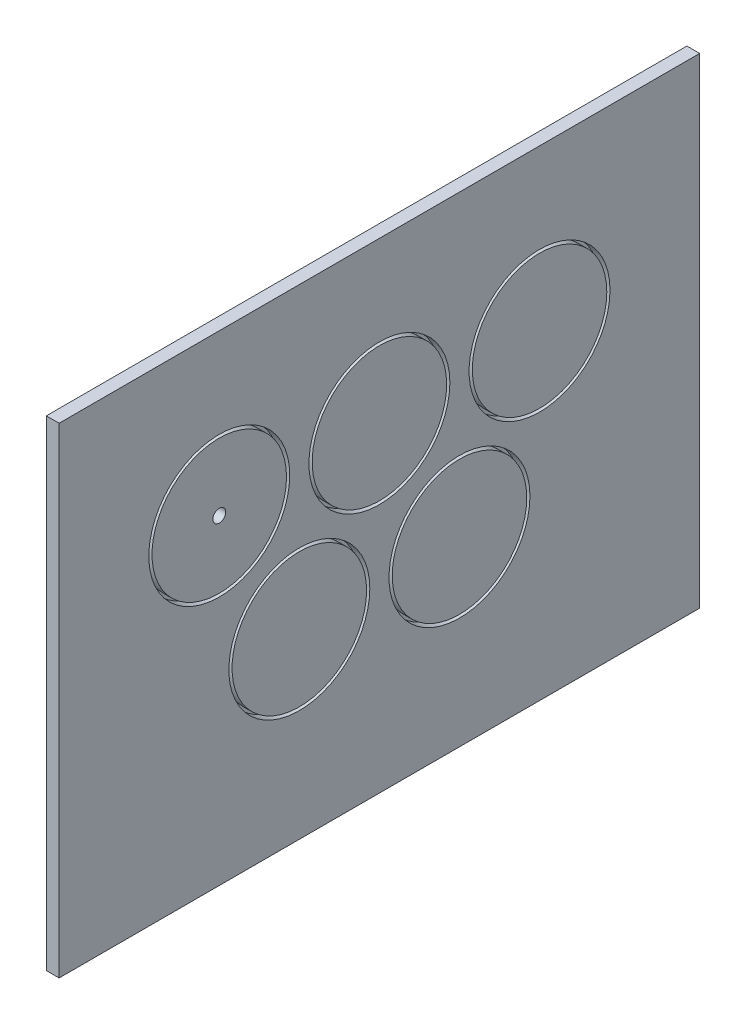
ISO-10303-21;
HEADER;
FILE_DESCRIPTION(('STEP AP214'),'2;1');
FILE_NAME('part.step','',(''),(''),'','','');
FILE_SCHEMA(('AUTOMOTIVE_DESIGN { 1 0 10303 214 1 1 1 1 }'));
ENDSEC;
DATA;
#1=APPLICATION_CONTEXT('core data for automotive mechanical design processes');
#2=APPLICATION_PROTOCOL_DEFINITION('international standard','automotive_design',2000,#1);
#3=PRODUCT_CONTEXT('',#1,'mechanical');
#4=PRODUCT('Part','Part','',(#3));
#5=PRODUCT_RELATED_PRODUCT_CATEGORY('part','',(#4));
#6=PRODUCT_DEFINITION_FORMATION('','',#4);
#7=PRODUCT_DEFINITION_CONTEXT('part definition',#1,'design');
#8=PRODUCT_DEFINITION('design','',#6,#7);
#9=PRODUCT_DEFINITION_SHAPE('','',#8);
#10=(LENGTH_UNIT() NAMED_UNIT(*) SI_UNIT(.MILLI.,.METRE.));
#11=(NAMED_UNIT(*) PLANE_ANGLE_UNIT() SI_UNIT($,.RADIAN.));
#12=(NAMED_UNIT(*) SI_UNIT($,.STERADIAN.) SOLID_ANGLE_UNIT());
#13=UNCERTAINTY_MEASURE_WITH_UNIT(LENGTH_MEASURE(1.E-05),#10,'distance_accuracy_value','');
#14=(GEOMETRIC_REPRESENTATION_CONTEXT(3) GLOBAL_UNCERTAINTY_ASSIGNED_CONTEXT((#13)) GLOBAL_UNIT_ASSIGNED_CONTEXT((#10,
#11,#12)) REPRESENTATION_CONTEXT('',''));
#15=CARTESIAN_POINT('',(0.,0.,0.));
#16=DIRECTION('',(0.,0.,1.));
#17=DIRECTION('',(1.,0.,0.));
#18=AXIS2_PLACEMENT_3D('',#15,#16,#17);
#19=CARTESIAN_POINT('',(20.,0.,0.));
#20=DIRECTION('',(-1.,0.,0.));
#21=DIRECTION('',(0.,0.,1.));
#22=AXIS2_PLACEMENT_3D('',#19,#20,#21);
#23=PLANE('',#22);
#24=CARTESIAN_POINT('',(20.,125.,250.));
#25=DIRECTION('',(1.,0.,0.));
#26=DIRECTION('',(0.,0.,-1.));
#27=AXIS2_PLACEMENT_3D('',#24,#25,#26);
#28=CIRCLE('',#27,9.99999999999998);
#29=CARTESIAN_POINT('',(20.,125.,240.));
#30=VERTEX_POINT('',#29);
#31=EDGE_CURVE('E129',#30,#30,#28,.T.);
#32=ORIENTED_EDGE('',*,*,#31,.F.);
#33=EDGE_LOOP('',(#32));
#34=FACE_BOUND('',#33,.T.);
#35=CARTESIAN_POINT('',(20.,125.,250.));
#36=DIRECTION('',(1.,0.,0.));
#37=DIRECTION('',(0.,0.,-1.));
#38=AXIS2_PLACEMENT_3D('',#35,#36,#37);
#39=CIRCLE('',#38,105.);
#40=CARTESIAN_POINT('',(20.,125.,145.));
#41=VERTEX_POINT('',#40);
#42=EDGE_CURVE('E152',#41,#41,#39,.T.);
#43=ORIENTED_EDGE('',*,*,#42,.T.);
#44=EDGE_LOOP('',(#43));
#45=FACE_BOUND('',#44,.T.);
#46=ADVANCED_FACE('F62',(#34,#45),#23,.F.);
#47=CARTESIAN_POINT('',(20.,-375.,-500.));
#48=DIRECTION('',(0.,0.,1.));
#49=DIRECTION('',(1.,0.,0.));
#50=AXIS2_PLACEMENT_3D('',#47,#48,#49);
#51=PLANE('',#50);
#52=DIRECTION('',(0.,1.,0.));
#53=VECTOR('',#52,1.);
#54=CARTESIAN_POINT('',(0.,-375.,-500.));
#55=LINE('',#54,#53);
#56=CARTESIAN_POINT('',(0.,-375.,-500.));
#57=VERTEX_POINT('',#56);
#58=CARTESIAN_POINT('',(0.,375.,-500.));
#59=VERTEX_POINT('',#58);
#60=EDGE_CURVE('E126',#57,#59,#55,.T.);
#61=ORIENTED_EDGE('',*,*,#60,.T.);
#62=DIRECTION('',(-1.,0.,0.));
#63=VECTOR('',#62,1.);
#64=CARTESIAN_POINT('',(20.,375.,-500.));
#65=LINE('',#64,#63);
#66=CARTESIAN_POINT('',(20.,375.,-500.));
#67=VERTEX_POINT('',#66);
#68=EDGE_CURVE('E12',#67,#59,#65,.T.);
#69=ORIENTED_EDGE('',*,*,#68,.F.);
#70=DIRECTION('',(0.,1.,0.));
#71=VECTOR('',#70,1.);
#72=CARTESIAN_POINT('',(20.,-375.,-500.));
#73=LINE('',#72,#71);
#74=CARTESIAN_POINT('',(20.,-375.,-500.));
#75=VERTEX_POINT('',#74);
#76=EDGE_CURVE('E114',#75,#67,#73,.T.);
#77=ORIENTED_EDGE('',*,*,#76,.F.);
#78=DIRECTION('',(-1.,0.,0.));
#79=VECTOR('',#78,1.);
#80=CARTESIAN_POINT('',(20.,-375.,-500.));
#81=LINE('',#80,#79);
#82=EDGE_CURVE('E122',#75,#57,#81,.T.);
#83=ORIENTED_EDGE('',*,*,#82,.T.);
#84=EDGE_LOOP('',(#61,#69,#77,#83));
#85=FACE_BOUND('',#84,.T.);
#86=ADVANCED_FACE('F64',(#85),#51,.F.);
#87=CARTESIAN_POINT('',(20.,375.,500.));
#88=DIRECTION('',(0.,-1.,0.));
#89=DIRECTION('',(0.,0.,-1.));
#90=AXIS2_PLACEMENT_3D('',#87,#88,#89);
#91=PLANE('',#90);
#92=DIRECTION('',(0.,0.,1.));
#93=VECTOR('',#92,1.);
#94=CARTESIAN_POINT('',(0.,375.,500.));
#95=LINE('',#94,#93);
#96=CARTESIAN_POINT('',(0.,375.,500.));
#97=VERTEX_POINT('',#96);
#98=EDGE_CURVE('E118',#59,#97,#95,.T.);
#99=ORIENTED_EDGE('',*,*,#98,.T.);
#100=DIRECTION('',(-1.,0.,0.));
#101=VECTOR('',#100,1.);
#102=CARTESIAN_POINT('',(20.,375.,500.));
#103=LINE('',#102,#101);
#104=CARTESIAN_POINT('',(20.,375.,500.));
#105=VERTEX_POINT('',#104);
#106=EDGE_CURVE('E71',#105,#97,#103,.T.);
#107=ORIENTED_EDGE('',*,*,#106,.F.);
#108=DIRECTION('',(0.,0.,1.));
#109=VECTOR('',#108,1.);
#110=CARTESIAN_POINT('',(20.,375.,500.));
#111=LINE('',#110,#109);
#112=EDGE_CURVE('E109',#67,#105,#111,.T.);
#113=ORIENTED_EDGE('',*,*,#112,.F.);
#114=ORIENTED_EDGE('',*,*,#68,.T.);
#115=EDGE_LOOP('',(#99,#107,#113,#114));
#116=FACE_BOUND('',#115,.T.);
#117=ADVANCED_FACE('F117',(#116),#91,.F.);
#118=CARTESIAN_POINT('',(20.,-375.,500.));
#119=DIRECTION('',(0.,0.,-1.));
#120=DIRECTION('',(-1.,0.,0.));
#121=AXIS2_PLACEMENT_3D('',#118,#119,#120);
#122=PLANE('',#121);
#123=DIRECTION('',(0.,-1.,0.));
#124=VECTOR('',#123,1.);
#125=CARTESIAN_POINT('',(0.,-375.,500.));
#126=LINE('',#125,#124);
#127=CARTESIAN_POINT('',(0.,-375.,500.));
#128=VERTEX_POINT('',#127);
#129=EDGE_CURVE('E96',#97,#128,#126,.T.);
#130=ORIENTED_EDGE('',*,*,#129,.T.);
#131=DIRECTION('',(-1.,0.,0.));
#132=VECTOR('',#131,1.);
#133=CARTESIAN_POINT('',(20.,-375.,500.));
#134=LINE('',#133,#132);
#135=CARTESIAN_POINT('',(20.,-375.,500.));
#136=VERTEX_POINT('',#135);
#137=EDGE_CURVE('E119',#136,#128,#134,.T.);
#138=ORIENTED_EDGE('',*,*,#137,.F.);
#139=DIRECTION('',(0.,-1.,0.));
#140=VECTOR('',#139,1.);
#141=CARTESIAN_POINT('',(20.,-375.,500.));
#142=LINE('',#141,#140);
#143=EDGE_CURVE('E112',#105,#136,#142,.T.);
#144=ORIENTED_EDGE('',*,*,#143,.F.);
#145=ORIENTED_EDGE('',*,*,#106,.T.);
#146=EDGE_LOOP('',(#130,#138,#144,#145));
#147=FACE_BOUND('',#146,.T.);
#148=ADVANCED_FACE('F120',(#147),#122,.F.);
#149=CARTESIAN_POINT('',(20.,-375.,500.));
#150=DIRECTION('',(0.,1.,0.));
#151=DIRECTION('',(0.,0.,1.));
#152=AXIS2_PLACEMENT_3D('',#149,#150,#151);
#153=PLANE('',#152);
#154=DIRECTION('',(0.,0.,-1.));
#155=VECTOR('',#154,1.);
#156=CARTESIAN_POINT('',(0.,-375.,500.));
#157=LINE('',#156,#155);
#158=EDGE_CURVE('E102',#128,#57,#157,.T.);
#159=ORIENTED_EDGE('',*,*,#158,.T.);
#160=ORIENTED_EDGE('',*,*,#82,.F.);
#161=DIRECTION('',(0.,0.,-1.));
#162=VECTOR('',#161,1.);
#163=CARTESIAN_POINT('',(20.,-375.,500.));
#164=LINE('',#163,#162);
#165=EDGE_CURVE('E79',#136,#75,#164,.T.);
#166=ORIENTED_EDGE('',*,*,#165,.F.);
#167=ORIENTED_EDGE('',*,*,#137,.T.);
#168=EDGE_LOOP('',(#159,#160,#166,#167));
#169=FACE_BOUND('',#168,.T.);
#170=ADVANCED_FACE('F134',(#169),#153,.F.);
#171=CARTESIAN_POINT('',(20.,-91.0000000000001,-125.));
#172=DIRECTION('',(1.,0.,0.));
#173=DIRECTION('',(0.,0.,-1.));
#174=AXIS2_PLACEMENT_3D('',#171,#172,#173);
#175=CIRCLE('',#174,110.);
#176=CARTESIAN_POINT('',(20.,-91.0000000000001,-235.));
#177=VERTEX_POINT('',#176);
#178=EDGE_CURVE('E182',#177,#177,#175,.T.);
#179=ORIENTED_EDGE('',*,*,#178,.F.);
#180=EDGE_LOOP('',(#179));
#181=FACE_BOUND('',#180,.T.);
#182=CARTESIAN_POINT('',(20.,125.,-1.11022302462516E-13));
#183=DIRECTION('',(1.,0.,0.));
#184=DIRECTION('',(0.,0.,-1.));
#185=AXIS2_PLACEMENT_3D('',#182,#183,#184);
#186=CIRCLE('',#185,110.);
#187=CARTESIAN_POINT('',(20.,125.,-110.));
#188=VERTEX_POINT('',#187);
#189=EDGE_CURVE('E170',#188,#188,#186,.T.);
#190=ORIENTED_EDGE('',*,*,#189,.F.);
#191=EDGE_LOOP('',(#190));
#192=FACE_BOUND('',#191,.T.);
#193=CARTESIAN_POINT('',(20.,125.,-250.));
#194=DIRECTION('',(1.,0.,0.));
#195=DIRECTION('',(0.,0.,-1.));
#196=AXIS2_PLACEMENT_3D('',#193,#194,#195);
#197=CIRCLE('',#196,110.);
#198=CARTESIAN_POINT('',(20.,125.,-360.));
#199=VERTEX_POINT('',#198);
#200=EDGE_CURVE('E194',#199,#199,#197,.T.);
#201=ORIENTED_EDGE('',*,*,#200,.F.);
#202=EDGE_LOOP('',(#201));
#203=FACE_BOUND('',#202,.T.);
#204=CARTESIAN_POINT('',(20.,-91.0000000000001,125.));
#205=DIRECTION('',(1.,0.,0.));
#206=DIRECTION('',(0.,0.,-1.));
#207=AXIS2_PLACEMENT_3D('',#204,#205,#206);
#208=CIRCLE('',#207,110.);
#209=CARTESIAN_POINT('',(20.,-91.0000000000001,14.9999999999999));
#210=VERTEX_POINT('',#209);
#211=EDGE_CURVE('E158',#210,#210,#208,.T.);
#212=ORIENTED_EDGE('',*,*,#211,.F.);
#213=EDGE_LOOP('',(#212));
#214=FACE_BOUND('',#213,.T.);
#215=CARTESIAN_POINT('',(20.,125.,250.));
#216=DIRECTION('',(1.,0.,0.));
#217=DIRECTION('',(0.,0.,-1.));
#218=AXIS2_PLACEMENT_3D('',#215,#216,#217);
#219=CIRCLE('',#218,110.);
#220=CARTESIAN_POINT('',(20.,125.,140.));
#221=VERTEX_POINT('',#220);
#222=EDGE_CURVE('E146',#221,#221,#219,.T.);
#223=ORIENTED_EDGE('',*,*,#222,.F.);
#224=EDGE_LOOP('',(#223));
#225=FACE_BOUND('',#224,.T.);
#226=ORIENTED_EDGE('',*,*,#76,.T.);
#227=ORIENTED_EDGE('',*,*,#112,.T.);
#228=ORIENTED_EDGE('',*,*,#143,.T.);
#229=ORIENTED_EDGE('',*,*,#165,.T.);
#230=EDGE_LOOP('',(#226,#227,#228,#229));
#231=FACE_BOUND('',#230,.T.);
#232=ADVANCED_FACE('F110',(#181,#192,#203,#214,#225,#231),#23,.F.);
#233=CARTESIAN_POINT('',(0.,0.,0.));
#234=DIRECTION('',(-1.,0.,0.));
#235=DIRECTION('',(0.,0.,1.));
#236=AXIS2_PLACEMENT_3D('',#233,#234,#235);
#237=PLANE('',#236);
#238=CARTESIAN_POINT('',(0.,125.,250.));
#239=DIRECTION('',(-1.,0.,0.));
#240=DIRECTION('',(0.,0.,1.));
#241=AXIS2_PLACEMENT_3D('',#238,#239,#240);
#242=CIRCLE('',#241,9.99999999999998);
#243=CARTESIAN_POINT('',(0.,125.,260.));
#244=VERTEX_POINT('',#243);
#245=EDGE_CURVE('E140',#244,#244,#242,.F.);
#246=ORIENTED_EDGE('',*,*,#245,.T.);
#247=EDGE_LOOP('',(#246));
#248=FACE_BOUND('',#247,.T.);
#249=ORIENTED_EDGE('',*,*,#60,.F.);
#250=ORIENTED_EDGE('',*,*,#158,.F.);
#251=ORIENTED_EDGE('',*,*,#129,.F.);
#252=ORIENTED_EDGE('',*,*,#98,.F.);
#253=EDGE_LOOP('',(#249,#250,#251,#252));
#254=FACE_BOUND('',#253,.T.);
#255=ADVANCED_FACE('F137',(#248,#254),#237,.T.);
#256=CARTESIAN_POINT('',(-0.001000000000001,125.,250.));
#257=DIRECTION('',(1.,0.,0.));
#258=DIRECTION('',(0.,0.,-1.));
#259=AXIS2_PLACEMENT_3D('',#256,#257,#258);
#260=CYLINDRICAL_SURFACE('',#259,9.99999999999998);
#261=ORIENTED_EDGE('',*,*,#245,.F.);
#262=EDGE_LOOP('',(#261));
#263=FACE_BOUND('',#262,.T.);
#264=ORIENTED_EDGE('',*,*,#31,.T.);
#265=EDGE_LOOP('',(#264));
#266=FACE_BOUND('',#265,.T.);
#267=ADVANCED_FACE('F234',(#263,#266),#260,.F.);
#268=CARTESIAN_POINT('',(5.,125.,250.));
#269=DIRECTION('',(1.,0.,0.));
#270=DIRECTION('',(0.,0.,-1.));
#271=AXIS2_PLACEMENT_3D('',#268,#269,#270);
#272=CYLINDRICAL_SURFACE('',#271,110.);
#273=CARTESIAN_POINT('',(5.,125.,250.));
#274=DIRECTION('',(1.,0.,0.));
#275=DIRECTION('',(0.,0.,-1.));
#276=AXIS2_PLACEMENT_3D('',#273,#274,#275);
#277=CIRCLE('',#276,110.);
#278=CARTESIAN_POINT('',(5.,125.,140.));
#279=VERTEX_POINT('',#278);
#280=EDGE_CURVE('E143',#279,#279,#277,.T.);
#281=ORIENTED_EDGE('',*,*,#280,.F.);
#282=EDGE_LOOP('',(#281));
#283=FACE_BOUND('',#282,.T.);
#284=ORIENTED_EDGE('',*,*,#222,.T.);
#285=EDGE_LOOP('',(#284));
#286=FACE_BOUND('',#285,.T.);
#287=ADVANCED_FACE('F231',(#283,#286),#272,.F.);
#288=CARTESIAN_POINT('',(5.,125.,250.));
#289=DIRECTION('',(1.,0.,0.));
#290=DIRECTION('',(0.,0.,-1.));
#291=AXIS2_PLACEMENT_3D('',#288,#289,#290);
#292=PLANE('',#291);
#293=CARTESIAN_POINT('',(5.,125.,250.));
#294=DIRECTION('',(1.,0.,0.));
#295=DIRECTION('',(0.,0.,-1.));
#296=AXIS2_PLACEMENT_3D('',#293,#294,#295);
#297=CIRCLE('',#296,105.);
#298=CARTESIAN_POINT('',(5.,125.,145.));
#299=VERTEX_POINT('',#298);
#300=EDGE_CURVE('E149',#299,#299,#297,.T.);
#301=ORIENTED_EDGE('',*,*,#300,.F.);
#302=EDGE_LOOP('',(#301));
#303=FACE_BOUND('',#302,.T.);
#304=ORIENTED_EDGE('',*,*,#280,.T.);
#305=EDGE_LOOP('',(#304));
#306=FACE_BOUND('',#305,.T.);
#307=ADVANCED_FACE('F233',(#303,#306),#292,.T.);
#308=CARTESIAN_POINT('',(5.,125.,250.));
#309=DIRECTION('',(1.,0.,0.));
#310=DIRECTION('',(0.,0.,-1.));
#311=AXIS2_PLACEMENT_3D('',#308,#309,#310);
#312=CYLINDRICAL_SURFACE('',#311,105.);
#313=ORIENTED_EDGE('',*,*,#300,.T.);
#314=EDGE_LOOP('',(#313));
#315=FACE_BOUND('',#314,.T.);
#316=ORIENTED_EDGE('',*,*,#42,.F.);
#317=EDGE_LOOP('',(#316));
#318=FACE_BOUND('',#317,.T.);
#319=ADVANCED_FACE('F241',(#315,#318),#312,.T.);
#320=CARTESIAN_POINT('',(5.,-91.0000000000001,125.));
#321=DIRECTION('',(1.,0.,0.));
#322=DIRECTION('',(0.,0.,-1.));
#323=AXIS2_PLACEMENT_3D('',#320,#321,#322);
#324=CYLINDRICAL_SURFACE('',#323,110.);
#325=CARTESIAN_POINT('',(5.,-91.0000000000001,125.));
#326=DIRECTION('',(1.,0.,0.));
#327=DIRECTION('',(0.,0.,-1.));
#328=AXIS2_PLACEMENT_3D('',#325,#326,#327);
#329=CIRCLE('',#328,110.);
#330=CARTESIAN_POINT('',(5.,-91.0000000000001,14.9999999999999));
#331=VERTEX_POINT('',#330);
#332=EDGE_CURVE('E155',#331,#331,#329,.T.);
#333=ORIENTED_EDGE('',*,*,#332,.F.);
#334=EDGE_LOOP('',(#333));
#335=FACE_BOUND('',#334,.T.);
#336=ORIENTED_EDGE('',*,*,#211,.T.);
#337=EDGE_LOOP('',(#336));
#338=FACE_BOUND('',#337,.T.);
#339=ADVANCED_FACE('F278',(#335,#338),#324,.F.);
#340=CARTESIAN_POINT('',(5.,-91.0000000000001,125.));
#341=DIRECTION('',(1.,0.,0.));
#342=DIRECTION('',(0.,0.,-1.));
#343=AXIS2_PLACEMENT_3D('',#340,#341,#342);
#344=PLANE('',#343);
#345=CARTESIAN_POINT('',(5.,-91.0000000000001,125.));
#346=DIRECTION('',(1.,0.,0.));
#347=DIRECTION('',(0.,0.,-1.));
#348=AXIS2_PLACEMENT_3D('',#345,#346,#347);
#349=CIRCLE('',#348,105.);
#350=CARTESIAN_POINT('',(5.,-91.0000000000001,19.9999999999999));
#351=VERTEX_POINT('',#350);
#352=EDGE_CURVE('E161',#351,#351,#349,.T.);
#353=ORIENTED_EDGE('',*,*,#352,.F.);
#354=EDGE_LOOP('',(#353));
#355=FACE_BOUND('',#354,.T.);
#356=ORIENTED_EDGE('',*,*,#332,.T.);
#357=EDGE_LOOP('',(#356));
#358=FACE_BOUND('',#357,.T.);
#359=ADVANCED_FACE('F272',(#355,#358),#344,.T.);
#360=CARTESIAN_POINT('',(5.,-91.0000000000001,125.));
#361=DIRECTION('',(1.,0.,0.));
#362=DIRECTION('',(0.,0.,-1.));
#363=AXIS2_PLACEMENT_3D('',#360,#361,#362);
#364=CYLINDRICAL_SURFACE('',#363,105.);
#365=ORIENTED_EDGE('',*,*,#352,.T.);
#366=EDGE_LOOP('',(#365));
#367=FACE_BOUND('',#366,.T.);
#368=CARTESIAN_POINT('',(20.,-91.0000000000001,125.));
#369=DIRECTION('',(1.,0.,0.));
#370=DIRECTION('',(0.,0.,-1.));
#371=AXIS2_PLACEMENT_3D('',#368,#369,#370);
#372=CIRCLE('',#371,105.);
#373=CARTESIAN_POINT('',(20.,-91.0000000000001,19.9999999999999));
#374=VERTEX_POINT('',#373);
#375=EDGE_CURVE('E164',#374,#374,#372,.T.);
#376=ORIENTED_EDGE('',*,*,#375,.F.);
#377=EDGE_LOOP('',(#376));
#378=FACE_BOUND('',#377,.T.);
#379=ADVANCED_FACE('F218',(#367,#378),#364,.T.);
#380=CARTESIAN_POINT('',(5.,125.,-250.));
#381=DIRECTION('',(1.,0.,0.));
#382=DIRECTION('',(0.,0.,-1.));
#383=AXIS2_PLACEMENT_3D('',#380,#381,#382);
#384=CYLINDRICAL_SURFACE('',#383,110.);
#385=CARTESIAN_POINT('',(5.,125.,-250.));
#386=DIRECTION('',(1.,0.,0.));
#387=DIRECTION('',(0.,0.,-1.));
#388=AXIS2_PLACEMENT_3D('',#385,#386,#387);
#389=CIRCLE('',#388,110.);
#390=CARTESIAN_POINT('',(5.,125.,-360.));
#391=VERTEX_POINT('',#390);
#392=EDGE_CURVE('E191',#391,#391,#389,.T.);
#393=ORIENTED_EDGE('',*,*,#392,.F.);
#394=EDGE_LOOP('',(#393));
#395=FACE_BOUND('',#394,.T.);
#396=ORIENTED_EDGE('',*,*,#200,.T.);
#397=EDGE_LOOP('',(#396));
#398=FACE_BOUND('',#397,.T.);
#399=ADVANCED_FACE('F212',(#395,#398),#384,.F.);
#400=CARTESIAN_POINT('',(5.,125.,-250.));
#401=DIRECTION('',(1.,0.,0.));
#402=DIRECTION('',(0.,0.,-1.));
#403=AXIS2_PLACEMENT_3D('',#400,#401,#402);
#404=PLANE('',#403);
#405=CARTESIAN_POINT('',(5.,125.,-250.));
#406=DIRECTION('',(1.,0.,0.));
#407=DIRECTION('',(0.,0.,-1.));
#408=AXIS2_PLACEMENT_3D('',#405,#406,#407);
#409=CIRCLE('',#408,105.);
#410=CARTESIAN_POINT('',(5.,125.,-355.));
#411=VERTEX_POINT('',#410);
#412=EDGE_CURVE('E197',#411,#411,#409,.T.);
#413=ORIENTED_EDGE('',*,*,#412,.F.);
#414=EDGE_LOOP('',(#413));
#415=FACE_BOUND('',#414,.T.);
#416=ORIENTED_EDGE('',*,*,#392,.T.);
#417=EDGE_LOOP('',(#416));
#418=FACE_BOUND('',#417,.T.);
#419=ADVANCED_FACE('F209',(#415,#418),#404,.T.);
#420=CARTESIAN_POINT('',(5.,125.,-250.));
#421=DIRECTION('',(1.,0.,0.));
#422=DIRECTION('',(0.,0.,-1.));
#423=AXIS2_PLACEMENT_3D('',#420,#421,#422);
#424=CYLINDRICAL_SURFACE('',#423,105.);
#425=ORIENTED_EDGE('',*,*,#412,.T.);
#426=EDGE_LOOP('',(#425));
#427=FACE_BOUND('',#426,.T.);
#428=CARTESIAN_POINT('',(20.,125.,-250.));
#429=DIRECTION('',(1.,0.,0.));
#430=DIRECTION('',(0.,0.,-1.));
#431=AXIS2_PLACEMENT_3D('',#428,#429,#430);
#432=CIRCLE('',#431,105.);
#433=CARTESIAN_POINT('',(20.,125.,-355.));
#434=VERTEX_POINT('',#433);
#435=EDGE_CURVE('E200',#434,#434,#432,.T.);
#436=ORIENTED_EDGE('',*,*,#435,.F.);
#437=EDGE_LOOP('',(#436));
#438=FACE_BOUND('',#437,.T.);
#439=ADVANCED_FACE('F206',(#427,#438),#424,.T.);
#440=CARTESIAN_POINT('',(5.,125.,-1.11022302462516E-13));
#441=DIRECTION('',(1.,0.,0.));
#442=DIRECTION('',(0.,0.,-1.));
#443=AXIS2_PLACEMENT_3D('',#440,#441,#442);
#444=CYLINDRICAL_SURFACE('',#443,110.);
#445=CARTESIAN_POINT('',(5.,125.,-1.11022302462516E-13));
#446=DIRECTION('',(1.,0.,0.));
#447=DIRECTION('',(0.,0.,-1.));
#448=AXIS2_PLACEMENT_3D('',#445,#446,#447);
#449=CIRCLE('',#448,110.);
#450=CARTESIAN_POINT('',(5.,125.,-110.));
#451=VERTEX_POINT('',#450);
#452=EDGE_CURVE('E167',#451,#451,#449,.T.);
#453=ORIENTED_EDGE('',*,*,#452,.F.);
#454=EDGE_LOOP('',(#453));
#455=FACE_BOUND('',#454,.T.);
#456=ORIENTED_EDGE('',*,*,#189,.T.);
#457=EDGE_LOOP('',(#456));
#458=FACE_BOUND('',#457,.T.);
#459=ADVANCED_FACE('F282',(#455,#458),#444,.F.);
#460=CARTESIAN_POINT('',(5.,125.,-1.11022302462516E-13));
#461=DIRECTION('',(1.,0.,0.));
#462=DIRECTION('',(0.,0.,-1.));
#463=AXIS2_PLACEMENT_3D('',#460,#461,#462);
#464=PLANE('',#463);
#465=CARTESIAN_POINT('',(5.,125.,-1.11022302462516E-13));
#466=DIRECTION('',(1.,0.,0.));
#467=DIRECTION('',(0.,0.,-1.));
#468=AXIS2_PLACEMENT_3D('',#465,#466,#467);
#469=CIRCLE('',#468,105.);
#470=CARTESIAN_POINT('',(5.,125.,-105.));
#471=VERTEX_POINT('',#470);
#472=EDGE_CURVE('E173',#471,#471,#469,.T.);
#473=ORIENTED_EDGE('',*,*,#472,.F.);
#474=EDGE_LOOP('',(#473));
#475=FACE_BOUND('',#474,.T.);
#476=ORIENTED_EDGE('',*,*,#452,.T.);
#477=EDGE_LOOP('',(#476));
#478=FACE_BOUND('',#477,.T.);
#479=ADVANCED_FACE('F340',(#475,#478),#464,.T.);
#480=CARTESIAN_POINT('',(5.,125.,-1.11022302462516E-13));
#481=DIRECTION('',(1.,0.,0.));
#482=DIRECTION('',(0.,0.,-1.));
#483=AXIS2_PLACEMENT_3D('',#480,#481,#482);
#484=CYLINDRICAL_SURFACE('',#483,105.);
#485=ORIENTED_EDGE('',*,*,#472,.T.);
#486=EDGE_LOOP('',(#485));
#487=FACE_BOUND('',#486,.T.);
#488=CARTESIAN_POINT('',(20.,125.,-1.11022302462516E-13));
#489=DIRECTION('',(1.,0.,0.));
#490=DIRECTION('',(0.,0.,-1.));
#491=AXIS2_PLACEMENT_3D('',#488,#489,#490);
#492=CIRCLE('',#491,105.);
#493=CARTESIAN_POINT('',(20.,125.,-105.));
#494=VERTEX_POINT('',#493);
#495=EDGE_CURVE('E176',#494,#494,#492,.T.);
#496=ORIENTED_EDGE('',*,*,#495,.F.);
#497=EDGE_LOOP('',(#496));
#498=FACE_BOUND('',#497,.T.);
#499=ADVANCED_FACE('F349',(#487,#498),#484,.T.);
#500=CARTESIAN_POINT('',(5.,-91.0000000000001,-125.));
#501=DIRECTION('',(1.,0.,0.));
#502=DIRECTION('',(0.,0.,-1.));
#503=AXIS2_PLACEMENT_3D('',#500,#501,#502);
#504=CYLINDRICAL_SURFACE('',#503,110.);
#505=CARTESIAN_POINT('',(5.,-91.0000000000001,-125.));
#506=DIRECTION('',(1.,0.,0.));
#507=DIRECTION('',(0.,0.,-1.));
#508=AXIS2_PLACEMENT_3D('',#505,#506,#507);
#509=CIRCLE('',#508,110.);
#510=CARTESIAN_POINT('',(5.,-91.0000000000001,-235.));
#511=VERTEX_POINT('',#510);
#512=EDGE_CURVE('E179',#511,#511,#509,.T.);
#513=ORIENTED_EDGE('',*,*,#512,.F.);
#514=EDGE_LOOP('',(#513));
#515=FACE_BOUND('',#514,.T.);
#516=ORIENTED_EDGE('',*,*,#178,.T.);
#517=EDGE_LOOP('',(#516));
#518=FACE_BOUND('',#517,.T.);
#519=ADVANCED_FACE('F358',(#515,#518),#504,.F.);
#520=CARTESIAN_POINT('',(5.,-91.0000000000001,-125.));
#521=DIRECTION('',(1.,0.,0.));
#522=DIRECTION('',(0.,0.,-1.));
#523=AXIS2_PLACEMENT_3D('',#520,#521,#522);
#524=PLANE('',#523);
#525=CARTESIAN_POINT('',(5.,-91.0000000000001,-125.));
#526=DIRECTION('',(1.,0.,0.));
#527=DIRECTION('',(0.,0.,-1.));
#528=AXIS2_PLACEMENT_3D('',#525,#526,#527);
#529=CIRCLE('',#528,105.);
#530=CARTESIAN_POINT('',(5.,-91.0000000000001,-230.));
#531=VERTEX_POINT('',#530);
#532=EDGE_CURVE('E185',#531,#531,#529,.T.);
#533=ORIENTED_EDGE('',*,*,#532,.F.);
#534=EDGE_LOOP('',(#533));
#535=FACE_BOUND('',#534,.T.);
#536=ORIENTED_EDGE('',*,*,#512,.T.);
#537=EDGE_LOOP('',(#536));
#538=FACE_BOUND('',#537,.T.);
#539=ADVANCED_FACE('F266',(#535,#538),#524,.T.);
#540=CARTESIAN_POINT('',(5.,-91.0000000000001,-125.));
#541=DIRECTION('',(1.,0.,0.));
#542=DIRECTION('',(0.,0.,-1.));
#543=AXIS2_PLACEMENT_3D('',#540,#541,#542);
#544=CYLINDRICAL_SURFACE('',#543,105.);
#545=ORIENTED_EDGE('',*,*,#532,.T.);
#546=EDGE_LOOP('',(#545));
#547=FACE_BOUND('',#546,.T.);
#548=CARTESIAN_POINT('',(20.,-91.0000000000001,-125.));
#549=DIRECTION('',(1.,0.,0.));
#550=DIRECTION('',(0.,0.,-1.));
#551=AXIS2_PLACEMENT_3D('',#548,#549,#550);
#552=CIRCLE('',#551,105.);
#553=CARTESIAN_POINT('',(20.,-91.0000000000001,-230.));
#554=VERTEX_POINT('',#553);
#555=EDGE_CURVE('E188',#554,#554,#552,.T.);
#556=ORIENTED_EDGE('',*,*,#555,.F.);
#557=EDGE_LOOP('',(#556));
#558=FACE_BOUND('',#557,.T.);
#559=ADVANCED_FACE('F258',(#547,#558),#544,.T.);
#560=ORIENTED_EDGE('',*,*,#375,.T.);
#561=EDGE_LOOP('',(#560));
#562=FACE_BOUND('',#561,.T.);
#563=ADVANCED_FACE('F249',(#562),#23,.F.);
#564=ORIENTED_EDGE('',*,*,#435,.T.);
#565=EDGE_LOOP('',(#564));
#566=FACE_BOUND('',#565,.T.);
#567=ADVANCED_FACE('F257',(#566),#23,.F.);
#568=ORIENTED_EDGE('',*,*,#495,.T.);
#569=EDGE_LOOP('',(#568));
#570=FACE_BOUND('',#569,.T.);
#571=ADVANCED_FACE('F264',(#570),#23,.F.);
#572=ORIENTED_EDGE('',*,*,#555,.T.);
#573=EDGE_LOOP('',(#572));
#574=FACE_BOUND('',#573,.T.);
#575=ADVANCED_FACE('F226',(#574),#23,.F.);
#576=CLOSED_SHELL('',(#46,#86,#117,#148,#170,#232,#255,#267,#287,#307,#319,#339,#359,#379,#399,
#419,#439,#459,#479,#499,#519,#539,#559,#563,#567,#571,#575));
#577=MANIFOLD_SOLID_BREP('B2',#576);
#578=ADVANCED_BREP_SHAPE_REPRESENTATION('',(#18,#577),#14);
#579=SHAPE_DEFINITION_REPRESENTATION(#9,#578);
ENDSEC;
END-ISO-10303-21;
